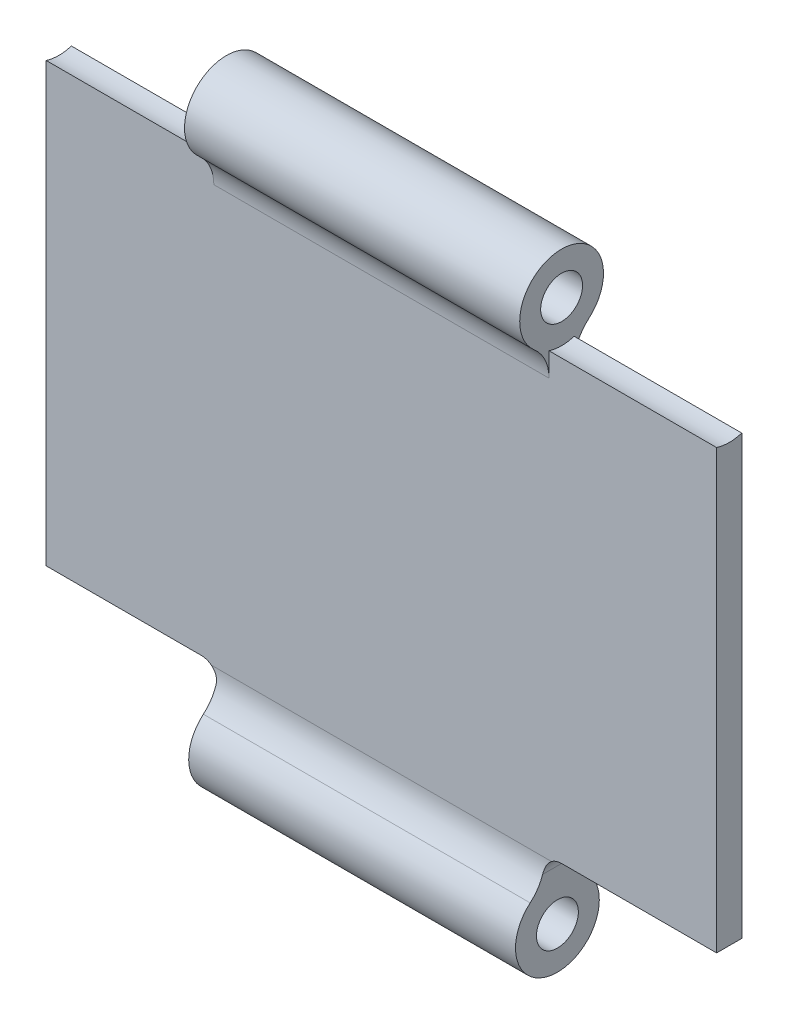
ISO-10303-21;
HEADER;
FILE_DESCRIPTION(('STEP AP214'),'2;1');
FILE_NAME('part.step','',(''),(''),'','','');
FILE_SCHEMA(('AUTOMOTIVE_DESIGN { 1 0 10303 214 1 1 1 1 }'));
ENDSEC;
DATA;
#1=APPLICATION_CONTEXT('core data for automotive mechanical design processes');
#2=APPLICATION_PROTOCOL_DEFINITION('international standard','automotive_design',2000,#1);
#3=PRODUCT_CONTEXT('',#1,'mechanical');
#4=PRODUCT('Part','Part','',(#3));
#5=PRODUCT_RELATED_PRODUCT_CATEGORY('part','',(#4));
#6=PRODUCT_DEFINITION_FORMATION('','',#4);
#7=PRODUCT_DEFINITION_CONTEXT('part definition',#1,'design');
#8=PRODUCT_DEFINITION('design','',#6,#7);
#9=PRODUCT_DEFINITION_SHAPE('','',#8);
#10=(LENGTH_UNIT() NAMED_UNIT(*) SI_UNIT(.MILLI.,.METRE.));
#11=(NAMED_UNIT(*) PLANE_ANGLE_UNIT() SI_UNIT($,.RADIAN.));
#12=(NAMED_UNIT(*) SI_UNIT($,.STERADIAN.) SOLID_ANGLE_UNIT());
#13=UNCERTAINTY_MEASURE_WITH_UNIT(LENGTH_MEASURE(1.E-05),#10,'distance_accuracy_value','');
#14=(GEOMETRIC_REPRESENTATION_CONTEXT(3) GLOBAL_UNCERTAINTY_ASSIGNED_CONTEXT((#13)) GLOBAL_UNIT_ASSIGNED_CONTEXT((#10,
#11,#12)) REPRESENTATION_CONTEXT('',''));
#15=CARTESIAN_POINT('',(0.,0.,0.));
#16=DIRECTION('',(0.,0.,1.));
#17=DIRECTION('',(1.,0.,0.));
#18=AXIS2_PLACEMENT_3D('',#15,#16,#17);
#19=CARTESIAN_POINT('',(0.,0.,3.));
#20=DIRECTION('',(0.,0.,-1.));
#21=DIRECTION('',(-1.,0.,0.));
#22=AXIS2_PLACEMENT_3D('',#19,#20,#21);
#23=PLANE('',#22);
#24=DIRECTION('',(-1.,0.,0.));
#25=VECTOR('',#24,1.);
#26=CARTESIAN_POINT('',(40.,27.7303039929153,3.));
#27=LINE('',#26,#25);
#28=CARTESIAN_POINT('',(20.,27.7303039929153,3.));
#29=VERTEX_POINT('',#28);
#30=CARTESIAN_POINT('',(40.,27.7303039929153,3.));
#31=VERTEX_POINT('',#30);
#32=EDGE_CURVE('E404',#29,#31,#27,.F.);
#33=ORIENTED_EDGE('',*,*,#32,.F.);
#34=DIRECTION('',(0.,-1.,0.));
#35=VECTOR('',#34,1.);
#36=CARTESIAN_POINT('',(20.,0.,3.));
#37=LINE('',#36,#35);
#38=CARTESIAN_POINT('',(20.,24.9006579232147,3.));
#39=VERTEX_POINT('',#38);
#40=EDGE_CURVE('E238',#29,#39,#37,.T.);
#41=ORIENTED_EDGE('',*,*,#40,.T.);
#42=DIRECTION('',(1.,0.,0.));
#43=VECTOR('',#42,1.);
#44=CARTESIAN_POINT('',(-20.,24.9006579232147,3.));
#45=LINE('',#44,#43);
#46=CARTESIAN_POINT('',(-20.,24.9006579232147,3.));
#47=VERTEX_POINT('',#46);
#48=EDGE_CURVE('E236',#39,#47,#45,.F.);
#49=ORIENTED_EDGE('',*,*,#48,.T.);
#50=DIRECTION('',(0.,1.,0.));
#51=VECTOR('',#50,1.);
#52=CARTESIAN_POINT('',(-20.,32.5,3.));
#53=LINE('',#52,#51);
#54=CARTESIAN_POINT('',(-20.,27.7303039929153,3.));
#55=VERTEX_POINT('',#54);
#56=EDGE_CURVE('E189',#47,#55,#53,.T.);
#57=ORIENTED_EDGE('',*,*,#56,.T.);
#58=DIRECTION('',(1.,0.,0.));
#59=VECTOR('',#58,1.);
#60=CARTESIAN_POINT('',(-40.,27.7303039929153,3.));
#61=LINE('',#60,#59);
#62=CARTESIAN_POINT('',(-40.,27.7303039929153,3.));
#63=VERTEX_POINT('',#62);
#64=EDGE_CURVE('E173',#55,#63,#61,.F.);
#65=ORIENTED_EDGE('',*,*,#64,.T.);
#66=DIRECTION('',(0.,1.,0.));
#67=VECTOR('',#66,1.);
#68=CARTESIAN_POINT('',(-40.,-32.5,3.));
#69=LINE('',#68,#67);
#70=CARTESIAN_POINT('',(-40.,-24.5,3.));
#71=VERTEX_POINT('',#70);
#72=EDGE_CURVE('E187',#71,#63,#69,.T.);
#73=ORIENTED_EDGE('',*,*,#72,.F.);
#74=DIRECTION('',(1.,0.,0.));
#75=VECTOR('',#74,1.);
#76=CARTESIAN_POINT('',(-40.,-24.5,3.));
#77=LINE('',#76,#75);
#78=CARTESIAN_POINT('',(-21.5,-24.5,3.));
#79=VERTEX_POINT('',#78);
#80=EDGE_CURVE('E364',#71,#79,#77,.T.);
#81=ORIENTED_EDGE('',*,*,#80,.T.);
#82=CARTESIAN_POINT('',(-21.5,-26.5,3.));
#83=DIRECTION('',(0.,0.,-1.));
#84=DIRECTION('',(-1.,0.,0.));
#85=AXIS2_PLACEMENT_3D('',#82,#83,#84);
#86=CIRCLE('',#85,2.);
#87=CARTESIAN_POINT('',(-20.29912326968,-24.9006579232147,3.));
#88=VERTEX_POINT('',#87);
#89=EDGE_CURVE('E53',#79,#88,#86,.T.);
#90=ORIENTED_EDGE('',*,*,#89,.T.);
#91=DIRECTION('',(1.,0.,0.));
#92=VECTOR('',#91,1.);
#93=CARTESIAN_POINT('',(19.5,-24.9006579232147,3.));
#94=LINE('',#93,#92);
#95=CARTESIAN_POINT('',(20.29912326968,-24.9006579232147,3.));
#96=VERTEX_POINT('',#95);
#97=EDGE_CURVE('E59',#88,#96,#94,.T.);
#98=ORIENTED_EDGE('',*,*,#97,.T.);
#99=CARTESIAN_POINT('',(21.5,-26.5,3.));
#100=DIRECTION('',(0.,0.,-1.));
#101=DIRECTION('',(-1.,0.,0.));
#102=AXIS2_PLACEMENT_3D('',#99,#100,#101);
#103=CIRCLE('',#102,2.);
#104=CARTESIAN_POINT('',(21.5,-24.5,3.));
#105=VERTEX_POINT('',#104);
#106=EDGE_CURVE('E352',#96,#105,#103,.T.);
#107=ORIENTED_EDGE('',*,*,#106,.T.);
#108=DIRECTION('',(1.,0.,0.));
#109=VECTOR('',#108,1.);
#110=CARTESIAN_POINT('',(40.,-24.5,3.));
#111=LINE('',#110,#109);
#112=CARTESIAN_POINT('',(40.,-24.5,3.));
#113=VERTEX_POINT('',#112);
#114=EDGE_CURVE('E377',#105,#113,#111,.T.);
#115=ORIENTED_EDGE('',*,*,#114,.T.);
#116=DIRECTION('',(0.,1.,0.));
#117=VECTOR('',#116,1.);
#118=CARTESIAN_POINT('',(40.,-32.5,3.));
#119=LINE('',#118,#117);
#120=EDGE_CURVE('E195',#113,#31,#119,.T.);
#121=ORIENTED_EDGE('',*,*,#120,.T.);
#122=EDGE_LOOP('',(#33,#41,#49,#57,#65,#73,#81,#90,#98,#107,#115,#121));
#123=FACE_BOUND('',#122,.T.);
#124=ADVANCED_FACE('F39',(#123),#23,.F.);
#125=CARTESIAN_POINT('',(0.,0.,0.));
#126=DIRECTION('',(0.,0.,-1.));
#127=DIRECTION('',(-1.,0.,0.));
#128=AXIS2_PLACEMENT_3D('',#125,#126,#127);
#129=PLANE('',#128);
#130=DIRECTION('',(-1.,0.,0.));
#131=VECTOR('',#130,1.);
#132=CARTESIAN_POINT('',(0.,24.9006579232147,0.));
#133=LINE('',#132,#131);
#134=CARTESIAN_POINT('',(-20.,24.9006579232147,0.));
#135=VERTEX_POINT('',#134);
#136=CARTESIAN_POINT('',(20.,24.9006579232147,0.));
#137=VERTEX_POINT('',#136);
#138=EDGE_CURVE('E244',#135,#137,#133,.F.);
#139=ORIENTED_EDGE('',*,*,#138,.T.);
#140=DIRECTION('',(0.,1.,0.));
#141=VECTOR('',#140,1.);
#142=CARTESIAN_POINT('',(20.,32.5,0.));
#143=LINE('',#142,#141);
#144=CARTESIAN_POINT('',(20.,27.7303039929153,0.));
#145=VERTEX_POINT('',#144);
#146=EDGE_CURVE('E247',#137,#145,#143,.T.);
#147=ORIENTED_EDGE('',*,*,#146,.T.);
#148=DIRECTION('',(-1.,0.,0.));
#149=VECTOR('',#148,1.);
#150=CARTESIAN_POINT('',(40.,27.7303039929153,0.));
#151=LINE('',#150,#149);
#152=CARTESIAN_POINT('',(40.,27.7303039929153,0.));
#153=VERTEX_POINT('',#152);
#154=EDGE_CURVE('E399',#145,#153,#151,.F.);
#155=ORIENTED_EDGE('',*,*,#154,.T.);
#156=DIRECTION('',(0.,1.,0.));
#157=VECTOR('',#156,1.);
#158=CARTESIAN_POINT('',(40.,-32.5,0.));
#159=LINE('',#158,#157);
#160=CARTESIAN_POINT('',(40.,-24.5,0.));
#161=VERTEX_POINT('',#160);
#162=EDGE_CURVE('E196',#161,#153,#159,.T.);
#163=ORIENTED_EDGE('',*,*,#162,.F.);
#164=DIRECTION('',(1.,0.,0.));
#165=VECTOR('',#164,1.);
#166=CARTESIAN_POINT('',(40.,-24.5,0.));
#167=LINE('',#166,#165);
#168=CARTESIAN_POINT('',(21.5,-24.5,0.));
#169=VERTEX_POINT('',#168);
#170=EDGE_CURVE('E382',#169,#161,#167,.T.);
#171=ORIENTED_EDGE('',*,*,#170,.F.);
#172=CARTESIAN_POINT('',(21.5,-26.5,0.));
#173=DIRECTION('',(0.,0.,-1.));
#174=DIRECTION('',(-1.,0.,0.));
#175=AXIS2_PLACEMENT_3D('',#172,#173,#174);
#176=CIRCLE('',#175,2.);
#177=CARTESIAN_POINT('',(20.29912326968,-24.9006579232147,0.));
#178=VERTEX_POINT('',#177);
#179=EDGE_CURVE('E271',#169,#178,#176,.F.);
#180=ORIENTED_EDGE('',*,*,#179,.T.);
#181=DIRECTION('',(-1.,0.,0.));
#182=VECTOR('',#181,1.);
#183=CARTESIAN_POINT('',(0.,-24.9006579232147,0.));
#184=LINE('',#183,#182);
#185=CARTESIAN_POINT('',(-20.29912326968,-24.9006579232147,0.));
#186=VERTEX_POINT('',#185);
#187=EDGE_CURVE('E67',#178,#186,#184,.T.);
#188=ORIENTED_EDGE('',*,*,#187,.T.);
#189=CARTESIAN_POINT('',(-21.5,-26.5,0.));
#190=DIRECTION('',(0.,0.,-1.));
#191=DIRECTION('',(-1.,0.,0.));
#192=AXIS2_PLACEMENT_3D('',#189,#190,#191);
#193=CIRCLE('',#192,2.);
#194=CARTESIAN_POINT('',(-21.5,-24.5,0.));
#195=VERTEX_POINT('',#194);
#196=EDGE_CURVE('E355',#186,#195,#193,.F.);
#197=ORIENTED_EDGE('',*,*,#196,.T.);
#198=DIRECTION('',(1.,0.,0.));
#199=VECTOR('',#198,1.);
#200=CARTESIAN_POINT('',(-40.,-24.5,0.));
#201=LINE('',#200,#199);
#202=CARTESIAN_POINT('',(-40.,-24.5,0.));
#203=VERTEX_POINT('',#202);
#204=EDGE_CURVE('E384',#203,#195,#201,.T.);
#205=ORIENTED_EDGE('',*,*,#204,.F.);
#206=DIRECTION('',(0.,1.,0.));
#207=VECTOR('',#206,1.);
#208=CARTESIAN_POINT('',(-40.,-32.5,0.));
#209=LINE('',#208,#207);
#210=CARTESIAN_POINT('',(-40.,27.7303039929153,0.));
#211=VERTEX_POINT('',#210);
#212=EDGE_CURVE('E202',#203,#211,#209,.T.);
#213=ORIENTED_EDGE('',*,*,#212,.T.);
#214=DIRECTION('',(1.,0.,0.));
#215=VECTOR('',#214,1.);
#216=CARTESIAN_POINT('',(-40.,27.7303039929153,0.));
#217=LINE('',#216,#215);
#218=CARTESIAN_POINT('',(-20.,27.7303039929153,0.));
#219=VERTEX_POINT('',#218);
#220=EDGE_CURVE('E176',#219,#211,#217,.F.);
#221=ORIENTED_EDGE('',*,*,#220,.F.);
#222=DIRECTION('',(0.,-1.,0.));
#223=VECTOR('',#222,1.);
#224=CARTESIAN_POINT('',(-20.,0.,0.));
#225=LINE('',#224,#223);
#226=EDGE_CURVE('E241',#219,#135,#225,.T.);
#227=ORIENTED_EDGE('',*,*,#226,.T.);
#228=EDGE_LOOP('',(#139,#147,#155,#163,#171,#180,#188,#197,#205,#213,#221,#227));
#229=FACE_BOUND('',#228,.T.);
#230=ADVANCED_FACE('F310',(#229),#129,.T.);
#231=CARTESIAN_POINT('',(-40.,-32.5,3.));
#232=DIRECTION('',(-1.,0.,0.));
#233=DIRECTION('',(0.,0.,1.));
#234=AXIS2_PLACEMENT_3D('',#231,#232,#233);
#235=PLANE('',#234);
#236=CARTESIAN_POINT('',(-40.,32.5,1.5));
#237=DIRECTION('',(1.,0.,0.));
#238=DIRECTION('',(0.,0.,-1.));
#239=AXIS2_PLACEMENT_3D('',#236,#237,#238);
#240=CIRCLE('',#239,5.);
#241=EDGE_CURVE('E169',#63,#211,#240,.T.);
#242=ORIENTED_EDGE('',*,*,#241,.T.);
#243=ORIENTED_EDGE('',*,*,#212,.F.);
#244=DIRECTION('',(0.,0.,-1.));
#245=VECTOR('',#244,1.);
#246=CARTESIAN_POINT('',(-40.,-24.5,135.651609764968));
#247=LINE('',#246,#245);
#248=EDGE_CURVE('E194',#71,#203,#247,.T.);
#249=ORIENTED_EDGE('',*,*,#248,.F.);
#250=ORIENTED_EDGE('',*,*,#72,.T.);
#251=EDGE_LOOP('',(#242,#243,#249,#250));
#252=FACE_BOUND('',#251,.T.);
#253=ADVANCED_FACE('F193',(#252),#235,.T.);
#254=CARTESIAN_POINT('',(40.,-32.5,3.));
#255=DIRECTION('',(-1.,0.,0.));
#256=DIRECTION('',(0.,0.,1.));
#257=AXIS2_PLACEMENT_3D('',#254,#255,#256);
#258=PLANE('',#257);
#259=CARTESIAN_POINT('',(40.,32.5,1.5));
#260=DIRECTION('',(1.,0.,0.));
#261=DIRECTION('',(0.,0.,-1.));
#262=AXIS2_PLACEMENT_3D('',#259,#260,#261);
#263=CIRCLE('',#262,5.);
#264=EDGE_CURVE('E405',#31,#153,#263,.T.);
#265=ORIENTED_EDGE('',*,*,#264,.F.);
#266=ORIENTED_EDGE('',*,*,#120,.F.);
#267=DIRECTION('',(0.,0.,-1.));
#268=VECTOR('',#267,1.);
#269=CARTESIAN_POINT('',(40.,-24.5,135.651609764968));
#270=LINE('',#269,#268);
#271=EDGE_CURVE('E205',#113,#161,#270,.T.);
#272=ORIENTED_EDGE('',*,*,#271,.T.);
#273=ORIENTED_EDGE('',*,*,#162,.T.);
#274=EDGE_LOOP('',(#265,#266,#272,#273));
#275=FACE_BOUND('',#274,.T.);
#276=ADVANCED_FACE('F321',(#275),#258,.F.);
#277=CARTESIAN_POINT('',(-40.,-24.5,135.651609764968));
#278=DIRECTION('',(0.,-1.,0.));
#279=DIRECTION('',(0.,0.,-1.));
#280=AXIS2_PLACEMENT_3D('',#277,#278,#279);
#281=PLANE('',#280);
#282=ORIENTED_EDGE('',*,*,#204,.T.);
#283=DIRECTION('',(0.,0.,-1.));
#284=VECTOR('',#283,1.);
#285=CARTESIAN_POINT('',(-21.5,-24.5,3.));
#286=LINE('',#285,#284);
#287=EDGE_CURVE('E269',#195,#79,#286,.F.);
#288=ORIENTED_EDGE('',*,*,#287,.T.);
#289=ORIENTED_EDGE('',*,*,#80,.F.);
#290=ORIENTED_EDGE('',*,*,#248,.T.);
#291=EDGE_LOOP('',(#282,#288,#289,#290));
#292=FACE_BOUND('',#291,.T.);
#293=ADVANCED_FACE('F324',(#292),#281,.T.);
#294=CARTESIAN_POINT('',(-19.5,-24.5,135.651609764968));
#295=DIRECTION('',(-1.,0.,0.));
#296=DIRECTION('',(0.,0.,1.));
#297=AXIS2_PLACEMENT_3D('',#294,#295,#296);
#298=PLANE('',#297);
#299=CARTESIAN_POINT('',(-19.5,-32.5,1.5));
#300=DIRECTION('',(-1.,0.,0.));
#301=DIRECTION('',(0.,-1.,0.));
#302=AXIS2_PLACEMENT_3D('',#299,#300,#301);
#303=CIRCLE('',#302,2.5);
#304=CARTESIAN_POINT('',(-19.5,-35.,1.5));
#305=VERTEX_POINT('',#304);
#306=EDGE_CURVE('E213',#305,#305,#303,.T.);
#307=ORIENTED_EDGE('',*,*,#306,.F.);
#308=EDGE_LOOP('',(#307));
#309=FACE_BOUND('',#308,.T.);
#310=CARTESIAN_POINT('',(-19.5,-24.9006579232147,8.));
#311=DIRECTION('',(-1.,0.,0.));
#312=DIRECTION('',(0.,0.,1.));
#313=AXIS2_PLACEMENT_3D('',#310,#311,#312);
#314=CIRCLE('',#313,5.);
#315=CARTESIAN_POINT('',(-19.5,-28.7003289616073,4.75));
#316=VERTEX_POINT('',#315);
#317=CARTESIAN_POINT('',(-19.5,-26.5,3.26269011764863));
#318=VERTEX_POINT('',#317);
#319=EDGE_CURVE('E220',#316,#318,#314,.F.);
#320=ORIENTED_EDGE('',*,*,#319,.T.);
#321=DIRECTION('',(0.,0.,-1.));
#322=VECTOR('',#321,1.);
#323=CARTESIAN_POINT('',(-19.5,-26.5,0.));
#324=LINE('',#323,#322);
#325=CARTESIAN_POINT('',(-19.5,-26.5,-0.262690117648631));
#326=VERTEX_POINT('',#325);
#327=EDGE_CURVE('E266',#318,#326,#324,.T.);
#328=ORIENTED_EDGE('',*,*,#327,.T.);
#329=CARTESIAN_POINT('',(-19.5,-24.9006579232147,-5.));
#330=DIRECTION('',(-1.,0.,0.));
#331=DIRECTION('',(0.,0.,1.));
#332=AXIS2_PLACEMENT_3D('',#329,#330,#331);
#333=CIRCLE('',#332,5.);
#334=CARTESIAN_POINT('',(-19.5,-28.7003289616073,-1.75));
#335=VERTEX_POINT('',#334);
#336=EDGE_CURVE('E225',#326,#335,#333,.F.);
#337=ORIENTED_EDGE('',*,*,#336,.T.);
#338=CARTESIAN_POINT('',(-19.5,-32.5,1.5));
#339=DIRECTION('',(-1.,0.,0.));
#340=DIRECTION('',(0.,0.,1.));
#341=AXIS2_PLACEMENT_3D('',#338,#339,#340);
#342=CIRCLE('',#341,5.);
#343=EDGE_CURVE('E212',#316,#335,#342,.F.);
#344=ORIENTED_EDGE('',*,*,#343,.F.);
#345=EDGE_LOOP('',(#320,#328,#337,#344));
#346=FACE_BOUND('',#345,.T.);
#347=ADVANCED_FACE('F370',(#309,#346),#298,.T.);
#348=CARTESIAN_POINT('',(40.,-24.5,135.651609764968));
#349=DIRECTION('',(0.,-1.,0.));
#350=DIRECTION('',(1.,0.,0.));
#351=AXIS2_PLACEMENT_3D('',#348,#349,#350);
#352=PLANE('',#351);
#353=ORIENTED_EDGE('',*,*,#114,.F.);
#354=DIRECTION('',(0.,0.,-1.));
#355=VECTOR('',#354,1.);
#356=CARTESIAN_POINT('',(21.5,-24.5,0.));
#357=LINE('',#356,#355);
#358=EDGE_CURVE('E257',#105,#169,#357,.T.);
#359=ORIENTED_EDGE('',*,*,#358,.T.);
#360=ORIENTED_EDGE('',*,*,#170,.T.);
#361=ORIENTED_EDGE('',*,*,#271,.F.);
#362=EDGE_LOOP('',(#353,#359,#360,#361));
#363=FACE_BOUND('',#362,.T.);
#364=ADVANCED_FACE('F318',(#363),#352,.T.);
#365=CARTESIAN_POINT('',(19.5,-24.5,135.651609764968));
#366=DIRECTION('',(1.,0.,0.));
#367=DIRECTION('',(0.,0.,-1.));
#368=AXIS2_PLACEMENT_3D('',#365,#366,#367);
#369=PLANE('',#368);
#370=CARTESIAN_POINT('',(19.5,-32.5,1.5));
#371=DIRECTION('',(1.,0.,0.));
#372=DIRECTION('',(0.,0.,-1.));
#373=AXIS2_PLACEMENT_3D('',#370,#371,#372);
#374=CIRCLE('',#373,2.5);
#375=CARTESIAN_POINT('',(19.5,-35.,1.5));
#376=VERTEX_POINT('',#375);
#377=EDGE_CURVE('E209',#376,#376,#374,.T.);
#378=ORIENTED_EDGE('',*,*,#377,.F.);
#379=EDGE_LOOP('',(#378));
#380=FACE_BOUND('',#379,.T.);
#381=CARTESIAN_POINT('',(19.5,-24.9006579232147,-5.));
#382=DIRECTION('',(1.,0.,0.));
#383=DIRECTION('',(0.,0.,-1.));
#384=AXIS2_PLACEMENT_3D('',#381,#382,#383);
#385=CIRCLE('',#384,5.);
#386=CARTESIAN_POINT('',(19.5,-28.7003289616073,-1.75));
#387=VERTEX_POINT('',#386);
#388=CARTESIAN_POINT('',(19.5,-26.5,-0.262690117648628));
#389=VERTEX_POINT('',#388);
#390=EDGE_CURVE('E227',#387,#389,#385,.F.);
#391=ORIENTED_EDGE('',*,*,#390,.T.);
#392=DIRECTION('',(0.,0.,-1.));
#393=VECTOR('',#392,1.);
#394=CARTESIAN_POINT('',(19.5,-26.5,3.));
#395=LINE('',#394,#393);
#396=CARTESIAN_POINT('',(19.5,-26.5,3.26269011764863));
#397=VERTEX_POINT('',#396);
#398=EDGE_CURVE('E264',#389,#397,#395,.F.);
#399=ORIENTED_EDGE('',*,*,#398,.T.);
#400=CARTESIAN_POINT('',(19.5,-24.9006579232147,8.));
#401=DIRECTION('',(1.,0.,0.));
#402=DIRECTION('',(0.,0.,-1.));
#403=AXIS2_PLACEMENT_3D('',#400,#401,#402);
#404=CIRCLE('',#403,5.);
#405=CARTESIAN_POINT('',(19.5,-28.7003289616073,4.75));
#406=VERTEX_POINT('',#405);
#407=EDGE_CURVE('E223',#397,#406,#404,.F.);
#408=ORIENTED_EDGE('',*,*,#407,.T.);
#409=CARTESIAN_POINT('',(19.5,-32.5,1.5));
#410=DIRECTION('',(1.,0.,0.));
#411=DIRECTION('',(0.,0.,-1.));
#412=AXIS2_PLACEMENT_3D('',#409,#410,#411);
#413=CIRCLE('',#412,5.);
#414=EDGE_CURVE('E375',#406,#387,#413,.T.);
#415=ORIENTED_EDGE('',*,*,#414,.T.);
#416=EDGE_LOOP('',(#391,#399,#408,#415));
#417=FACE_BOUND('',#416,.T.);
#418=ADVANCED_FACE('F447',(#380,#417),#369,.T.);
#419=CARTESIAN_POINT('',(33.642135623731,-32.5,1.5));
#420=DIRECTION('',(-1.,0.,0.));
#421=DIRECTION('',(0.,0.,1.));
#422=AXIS2_PLACEMENT_3D('',#419,#420,#421);
#423=CYLINDRICAL_SURFACE('',#422,5.);
#424=ORIENTED_EDGE('',*,*,#414,.F.);
#425=DIRECTION('',(-1.,0.,0.));
#426=VECTOR('',#425,1.);
#427=CARTESIAN_POINT('',(33.642135623731,-28.7003289616073,4.75));
#428=LINE('',#427,#426);
#429=EDGE_CURVE('E215',#406,#316,#428,.T.);
#430=ORIENTED_EDGE('',*,*,#429,.T.);
#431=ORIENTED_EDGE('',*,*,#343,.T.);
#432=DIRECTION('',(-1.,0.,0.));
#433=VECTOR('',#432,1.);
#434=CARTESIAN_POINT('',(33.642135623731,-28.7003289616073,-1.75));
#435=LINE('',#434,#433);
#436=EDGE_CURVE('E199',#335,#387,#435,.F.);
#437=ORIENTED_EDGE('',*,*,#436,.T.);
#438=EDGE_LOOP('',(#424,#430,#431,#437));
#439=FACE_BOUND('',#438,.T.);
#440=ADVANCED_FACE('F339',(#439),#423,.T.);
#441=CARTESIAN_POINT('',(40.,-32.5,1.5));
#442=DIRECTION('',(-1.,0.,0.));
#443=DIRECTION('',(0.,-1.,0.));
#444=AXIS2_PLACEMENT_3D('',#441,#442,#443);
#445=CYLINDRICAL_SURFACE('',#444,2.5);
#446=CARTESIAN_POINT('',(19.5,-35.,1.5));
#447=CARTESIAN_POINT('',(19.09375,-35.,1.5));
#448=CARTESIAN_POINT('',(18.6875,-35.,1.5));
#449=CARTESIAN_POINT('',(17.875,-35.,1.5));
#450=CARTESIAN_POINT('',(17.46875,-35.,1.5));
#451=CARTESIAN_POINT('',(16.65625,-35.,1.5));
#452=CARTESIAN_POINT('',(16.25,-35.,1.5));
#453=CARTESIAN_POINT('',(15.4375,-35.,1.5));
#454=CARTESIAN_POINT('',(15.03125,-35.,1.5));
#455=CARTESIAN_POINT('',(14.21875,-35.,1.5));
#456=CARTESIAN_POINT('',(13.8125,-35.,1.5));
#457=CARTESIAN_POINT('',(13.,-35.,1.5));
#458=CARTESIAN_POINT('',(12.59375,-35.,1.5));
#459=CARTESIAN_POINT('',(11.78125,-35.,1.5));
#460=CARTESIAN_POINT('',(11.375,-35.,1.5));
#461=CARTESIAN_POINT('',(10.5625,-35.,1.5));
#462=CARTESIAN_POINT('',(10.15625,-35.,1.5));
#463=CARTESIAN_POINT('',(9.34375000000001,-35.,1.5));
#464=CARTESIAN_POINT('',(8.93750000000001,-35.,1.5));
#465=CARTESIAN_POINT('',(8.12500000000001,-35.,1.5));
#466=CARTESIAN_POINT('',(7.71875000000001,-35.,1.5));
#467=CARTESIAN_POINT('',(6.90625000000001,-35.,1.5));
#468=CARTESIAN_POINT('',(6.50000000000001,-35.,1.5));
#469=CARTESIAN_POINT('',(5.68750000000001,-35.,1.5));
#470=CARTESIAN_POINT('',(5.28125000000001,-35.,1.5));
#471=CARTESIAN_POINT('',(4.46875000000001,-35.,1.5));
#472=CARTESIAN_POINT('',(4.06250000000001,-35.,1.5));
#473=CARTESIAN_POINT('',(3.25000000000001,-35.,1.5));
#474=CARTESIAN_POINT('',(2.84375000000001,-35.,1.5));
#475=CARTESIAN_POINT('',(2.03125000000001,-35.,1.5));
#476=CARTESIAN_POINT('',(1.62500000000001,-35.,1.5));
#477=CARTESIAN_POINT('',(0.81250000000001,-35.,1.5));
#478=CARTESIAN_POINT('',(0.406250000000009,-35.,1.5));
#479=CARTESIAN_POINT('',(-0.406249999999992,-35.,1.5));
#480=CARTESIAN_POINT('',(-0.812499999999991,-35.,1.5));
#481=CARTESIAN_POINT('',(-1.62499999999999,-35.,1.5));
#482=CARTESIAN_POINT('',(-2.03124999999999,-35.,1.5));
#483=CARTESIAN_POINT('',(-2.84374999999999,-35.,1.5));
#484=CARTESIAN_POINT('',(-3.24999999999999,-35.,1.5));
#485=CARTESIAN_POINT('',(-4.06249999999999,-35.,1.5));
#486=CARTESIAN_POINT('',(-4.46874999999999,-35.,1.5));
#487=CARTESIAN_POINT('',(-5.28124999999998,-35.,1.5));
#488=CARTESIAN_POINT('',(-5.68749999999999,-35.,1.5));
#489=CARTESIAN_POINT('',(-6.49999999999999,-35.,1.5));
#490=CARTESIAN_POINT('',(-6.90624999999999,-35.,1.5));
#491=CARTESIAN_POINT('',(-7.71874999999998,-35.,1.5));
#492=CARTESIAN_POINT('',(-8.12499999999998,-35.,1.5));
#493=CARTESIAN_POINT('',(-8.93749999999999,-35.,1.5));
#494=CARTESIAN_POINT('',(-9.34374999999999,-35.,1.5));
#495=CARTESIAN_POINT('',(-10.15625,-35.,1.5));
#496=CARTESIAN_POINT('',(-10.5625,-35.,1.5));
#497=CARTESIAN_POINT('',(-11.375,-35.,1.5));
#498=CARTESIAN_POINT('',(-11.78125,-35.,1.5));
#499=CARTESIAN_POINT('',(-12.59375,-35.,1.5));
#500=CARTESIAN_POINT('',(-13.,-35.,1.5));
#501=CARTESIAN_POINT('',(-13.8125,-35.,1.5));
#502=CARTESIAN_POINT('',(-14.21875,-35.,1.5));
#503=CARTESIAN_POINT('',(-15.03125,-35.,1.5));
#504=CARTESIAN_POINT('',(-15.4375,-35.,1.5));
#505=CARTESIAN_POINT('',(-16.25,-35.,1.5));
#506=CARTESIAN_POINT('',(-16.65625,-35.,1.5));
#507=CARTESIAN_POINT('',(-17.46875,-35.,1.5));
#508=CARTESIAN_POINT('',(-17.875,-35.,1.5));
#509=CARTESIAN_POINT('',(-18.6875,-35.,1.5));
#510=CARTESIAN_POINT('',(-19.09375,-35.,1.5));
#511=CARTESIAN_POINT('',(-19.5,-35.,1.5));
#512=B_SPLINE_CURVE_WITH_KNOTS('',3,(#446,#447,#448,#449,#450,#451,#452,#453,#454,#455,#456,
#457,#458,#459,#460,#461,#462,#463,#464,#465,#466,#467,#468,#469,#470,#471,#472,#473,#474,#475,
#476,#477,#478,#479,#480,#481,#482,#483,#484,#485,#486,#487,#488,#489,#490,#491,#492,#493,#494,
#495,#496,#497,#498,#499,#500,#501,#502,#503,#504,#505,#506,#507,#508,#509,#510,#511),
.UNSPECIFIED.,.F.,.F.,(4,2,2,2,2,2,2,2,2,2,2,2,2,2,2,2,2,2,2,2,2,2,2,2,2,2,2,2,2,2,2,2,4),(0.,
1.21875,2.4375,3.65625,4.875,6.09375,7.3125,8.53125,9.74999999999999,10.96875,12.1875,13.40625,
14.625,15.84375,17.0625,18.28125,19.5,20.71875,21.9375,23.15625,24.375,25.59375,26.8125,
28.03125,29.25,30.46875,31.6875,32.90625,34.125,35.34375,36.5625,37.78125,39.),.UNSPECIFIED.);
#513=EDGE_CURVE('BSEAM330',#376,#305,#512,.T.);
#514=ORIENTED_EDGE('',*,*,#377,.T.);
#515=ORIENTED_EDGE('',*,*,#306,.T.);
#516=ORIENTED_EDGE('',*,*,#513,.T.);
#517=ORIENTED_EDGE('',*,*,#513,.F.);
#518=EDGE_LOOP('',(#514,#516,#515,#517));
#519=FACE_BOUND('',#518,.T.);
#520=ADVANCED_FACE('F330',(#519),#445,.F.);
#521=CARTESIAN_POINT('',(33.642135623731,-24.9006579232147,8.));
#522=DIRECTION('',(-1.,0.,0.));
#523=DIRECTION('',(0.,0.,1.));
#524=AXIS2_PLACEMENT_3D('',#521,#522,#523);
#525=CYLINDRICAL_SURFACE('',#524,5.);
#526=ORIENTED_EDGE('',*,*,#407,.F.);
#527=CARTESIAN_POINT('',(19.5,-26.5,3.26269011764863));
#528=CARTESIAN_POINT('',(19.4999936966678,-26.4485390306566,3.24530870783693));
#529=CARTESIAN_POINT('',(19.501986360827,-26.3967839827995,3.22877786014896));
#530=CARTESIAN_POINT('',(19.5100574791647,-26.293045638152,3.19748263196914));
#531=CARTESIAN_POINT('',(19.5161369747705,-26.2410622865392,3.18271870286248));
#532=CARTESIAN_POINT('',(19.5324540650706,-26.1373532528805,3.15505809683407));
#533=CARTESIAN_POINT('',(19.5426836750113,-26.0856272680361,3.1421578983974));
#534=CARTESIAN_POINT('',(19.5673156075382,-25.9827642213211,3.11821335981919));
#535=CARTESIAN_POINT('',(19.5817174232379,-25.9316270886944,3.10716879449188));
#536=CARTESIAN_POINT('',(19.6312621603462,-25.7794581144575,3.07675161729261));
#537=CARTESIAN_POINT('',(19.6727188083601,-25.6798343516974,3.06013902114915));
#538=CARTESIAN_POINT('',(19.7715774176784,-25.4879618750905,3.03366436460592));
#539=CARTESIAN_POINT('',(19.8289772326559,-25.3957121706727,3.02380139616549));
#540=CARTESIAN_POINT('',(19.9508066860262,-25.231449118901,3.01035306357623));
#541=CARTESIAN_POINT('',(20.0136795036377,-25.1583280981234,3.00617834323463));
#542=CARTESIAN_POINT('',(20.11539275904,-25.0559824032002,3.00229587156852));
#543=CARTESIAN_POINT('',(20.1505551458474,-25.023071789938,3.00139849790321));
#544=CARTESIAN_POINT('',(20.2231670690983,-24.9598658978559,3.00025096271696));
#545=CARTESIAN_POINT('',(20.2606166025268,-24.9295706155885,3.00000080034288));
#546=CARTESIAN_POINT('',(20.29912326968,-24.9006579232147,3.));
#547=B_SPLINE_CURVE_WITH_KNOTS('',3,(#527,#528,#529,#530,#531,#532,#533,#534,#535,#536,#537,
#538,#539,#540,#541,#542,#543,#544,#545,#546),.UNSPECIFIED.,.F.,.F.,(4,2,2,2,2,2,2,2,2,4),(0.,
0.16291594834693,0.325873427513106,0.488518854839466,0.651144530455444,0.976908622207142,
1.30262887965612,1.59106417732792,1.73545996109784,1.87985555452942),.UNSPECIFIED.);
#548=EDGE_CURVE('E280',#397,#96,#547,.T.);
#549=ORIENTED_EDGE('',*,*,#548,.T.);
#550=ORIENTED_EDGE('',*,*,#97,.F.);
#551=CARTESIAN_POINT('',(-20.29912326968,-24.9006579232147,3.));
#552=CARTESIAN_POINT('',(-20.2556342851634,-24.933312149289,3.00000148283011));
#553=CARTESIAN_POINT('',(-20.2134965946665,-24.9677271872563,3.0003202937365));
#554=CARTESIAN_POINT('',(-20.1321647842561,-25.0398680129898,3.0018074908761));
#555=CARTESIAN_POINT('',(-20.0929710450177,-25.0775942275531,3.00297598677208));
#556=CARTESIAN_POINT('',(-19.9803628172862,-25.1952227585531,3.00807027847123));
#557=CARTESIAN_POINT('',(-19.9117117726822,-25.2797326535353,3.01358284916839));
#558=CARTESIAN_POINT('',(-19.7891211933571,-25.4585209012946,3.03040651748096));
#559=CARTESIAN_POINT('',(-19.735211957861,-25.5528188313157,3.04172942193871));
#560=CARTESIAN_POINT('',(-19.6436465224966,-25.7479654372522,3.07132997620063));
#561=CARTESIAN_POINT('',(-19.6059846675166,-25.8488118198098,3.0896052019845));
#562=CARTESIAN_POINT('',(-19.5509455651133,-26.0416980298741,3.13105854413074));
#563=CARTESIAN_POINT('',(-19.5317111693805,-26.1333885083769,3.15341333081105));
#564=CARTESIAN_POINT('',(-19.5126029798928,-26.2710661085761,3.19123061490391));
#565=CARTESIAN_POINT('',(-19.507857598662,-26.3170194007019,3.20456304406775));
#566=CARTESIAN_POINT('',(-19.5015558781655,-26.4087194068859,3.23260524437806));
#567=CARTESIAN_POINT('',(-19.4999991935453,-26.4544661427799,3.24731486618606));
#568=CARTESIAN_POINT('',(-19.5,-26.5,3.26269011764863));
#569=B_SPLINE_CURVE_WITH_KNOTS('',3,(#551,#552,#553,#554,#555,#556,#557,#558,#559,#560,#561,
#562,#563,#564,#565,#566,#567,#568),.UNSPECIFIED.,.F.,.F.,(4,2,2,2,2,2,2,2,4),(0.,
0.163057037340509,0.326135123025453,0.651514296087931,0.977557287084462,1.30348670284221,
1.59129935396486,1.73543831954241,1.87956167320295),.UNSPECIFIED.);
#570=EDGE_CURVE('E11',#88,#318,#569,.T.);
#571=ORIENTED_EDGE('',*,*,#570,.T.);
#572=ORIENTED_EDGE('',*,*,#319,.F.);
#573=ORIENTED_EDGE('',*,*,#429,.F.);
#574=EDGE_LOOP('',(#526,#549,#550,#571,#572,#573));
#575=FACE_BOUND('',#574,.T.);
#576=ADVANCED_FACE('F327',(#575),#525,.F.);
#577=CARTESIAN_POINT('',(33.642135623731,-24.9006579232147,-5.));
#578=DIRECTION('',(-1.,0.,0.));
#579=DIRECTION('',(0.,0.,1.));
#580=AXIS2_PLACEMENT_3D('',#577,#578,#579);
#581=CYLINDRICAL_SURFACE('',#580,5.);
#582=ORIENTED_EDGE('',*,*,#390,.F.);
#583=ORIENTED_EDGE('',*,*,#436,.F.);
#584=ORIENTED_EDGE('',*,*,#336,.F.);
#585=CARTESIAN_POINT('',(-19.5,-26.5,-0.262690117648631));
#586=CARTESIAN_POINT('',(-19.4999936966678,-26.4485390306566,-0.245308707836929));
#587=CARTESIAN_POINT('',(-19.501986360827,-26.3967839827995,-0.228777860148957));
#588=CARTESIAN_POINT('',(-19.5100574791647,-26.293045638152,-0.197482631969144));
#589=CARTESIAN_POINT('',(-19.5161369747705,-26.2410622865393,-0.182718702862479));
#590=CARTESIAN_POINT('',(-19.5324540650706,-26.1373532528805,-0.155058096834066));
#591=CARTESIAN_POINT('',(-19.5426836750113,-26.0856272680361,-0.142157898397405));
#592=CARTESIAN_POINT('',(-19.5673156075382,-25.9827642213211,-0.118213359819189));
#593=CARTESIAN_POINT('',(-19.5817174232379,-25.9316270886944,-0.107168794491885));
#594=CARTESIAN_POINT('',(-19.6312621603462,-25.7794581144575,-0.0767516172926081));
#595=CARTESIAN_POINT('',(-19.6727188083601,-25.6798343516974,-0.0601390211491482));
#596=CARTESIAN_POINT('',(-19.7715774176784,-25.4879618750905,-0.0336643646059183));
#597=CARTESIAN_POINT('',(-19.8289772326559,-25.3957121706727,-0.0238013961654859));
#598=CARTESIAN_POINT('',(-19.9508066860262,-25.231449118901,-0.0103530635762288));
#599=CARTESIAN_POINT('',(-20.0136795036377,-25.1583280981234,-0.00617834323463423));
#600=CARTESIAN_POINT('',(-20.11539275904,-25.0559824032002,-0.00229587156851568));
#601=CARTESIAN_POINT('',(-20.1505551458474,-25.023071789938,-0.00139849790320961));
#602=CARTESIAN_POINT('',(-20.2231670690983,-24.9598658978559,-0.000250962716957362));
#603=CARTESIAN_POINT('',(-20.2606166025268,-24.9295706155885,-8.00342876513174E-07));
#604=CARTESIAN_POINT('',(-20.29912326968,-24.9006579232147,0.));
#605=B_SPLINE_CURVE_WITH_KNOTS('',3,(#585,#586,#587,#588,#589,#590,#591,#592,#593,#594,#595,
#596,#597,#598,#599,#600,#601,#602,#603,#604),.UNSPECIFIED.,.F.,.F.,(4,2,2,2,2,2,2,2,2,4),(0.,
0.162915948346927,0.325873427513106,0.488518854839463,0.65114453045544,0.976908622207134,
1.30262887965611,1.59106417732792,1.73545996109784,1.87985555452943),.UNSPECIFIED.);
#606=EDGE_CURVE('E353',#326,#186,#605,.T.);
#607=ORIENTED_EDGE('',*,*,#606,.T.);
#608=ORIENTED_EDGE('',*,*,#187,.F.);
#609=CARTESIAN_POINT('',(20.29912326968,-24.9006579232147,0.));
#610=CARTESIAN_POINT('',(20.2556342851634,-24.933312149289,-1.48283011471906E-06));
#611=CARTESIAN_POINT('',(20.2134965946665,-24.9677271872563,-0.000320293736501921));
#612=CARTESIAN_POINT('',(20.132164784256,-25.0398680129898,-0.00180749087609766));
#613=CARTESIAN_POINT('',(20.0929710450177,-25.0775942275531,-0.00297598677208535));
#614=CARTESIAN_POINT('',(19.9803628172862,-25.1952227585531,-0.0080702784712348));
#615=CARTESIAN_POINT('',(19.9117117726822,-25.2797326535354,-0.0135828491683937));
#616=CARTESIAN_POINT('',(19.7891211933571,-25.4585209012947,-0.0304065174809556));
#617=CARTESIAN_POINT('',(19.735211957861,-25.5528188313157,-0.0417294219387063));
#618=CARTESIAN_POINT('',(19.6436465224966,-25.7479654372522,-0.0713299762006369));
#619=CARTESIAN_POINT('',(19.6059846675166,-25.8488118198098,-0.0896052019844984));
#620=CARTESIAN_POINT('',(19.5509455651133,-26.0416980298742,-0.131058544130742));
#621=CARTESIAN_POINT('',(19.5317111693805,-26.1333885083769,-0.153413330811054));
#622=CARTESIAN_POINT('',(19.5126029798928,-26.2710661085761,-0.191230614903914));
#623=CARTESIAN_POINT('',(19.507857598662,-26.3170194007019,-0.204563044067745));
#624=CARTESIAN_POINT('',(19.5015558781655,-26.4087194068859,-0.232605244378053));
#625=CARTESIAN_POINT('',(19.4999991935453,-26.4544661427799,-0.247314866186056));
#626=CARTESIAN_POINT('',(19.5,-26.5,-0.262690117648628));
#627=B_SPLINE_CURVE_WITH_KNOTS('',3,(#609,#610,#611,#612,#613,#614,#615,#616,#617,#618,#619,
#620,#621,#622,#623,#624,#625,#626),.UNSPECIFIED.,.F.,.F.,(4,2,2,2,2,2,2,2,4),(0.,
0.163057037340514,0.326135123025456,0.651514296087931,0.977557287084466,1.30348670284221,
1.59129935396485,1.73543831954239,1.87956167320293),.UNSPECIFIED.);
#628=EDGE_CURVE('E273',#178,#389,#627,.T.);
#629=ORIENTED_EDGE('',*,*,#628,.T.);
#630=EDGE_LOOP('',(#582,#583,#584,#607,#608,#629));
#631=FACE_BOUND('',#630,.T.);
#632=ADVANCED_FACE('F286',(#631),#581,.F.);
#633=CARTESIAN_POINT('',(20.,32.5,1.5));
#634=DIRECTION('',(-1.,0.,0.));
#635=DIRECTION('',(0.,0.,1.));
#636=AXIS2_PLACEMENT_3D('',#633,#634,#635);
#637=CYLINDRICAL_SURFACE('',#636,5.);
#638=CARTESIAN_POINT('',(-20.,32.5,1.5));
#639=DIRECTION('',(1.,0.,0.));
#640=DIRECTION('',(0.,0.,-1.));
#641=AXIS2_PLACEMENT_3D('',#638,#639,#640);
#642=CIRCLE('',#641,5.);
#643=CARTESIAN_POINT('',(-20.,28.7003289616073,-1.75));
#644=VERTEX_POINT('',#643);
#645=CARTESIAN_POINT('',(-20.,28.7003289616073,4.75));
#646=VERTEX_POINT('',#645);
#647=EDGE_CURVE('E407',#644,#646,#642,.T.);
#648=ORIENTED_EDGE('',*,*,#647,.T.);
#649=DIRECTION('',(-1.,0.,0.));
#650=VECTOR('',#649,1.);
#651=CARTESIAN_POINT('',(20.,28.7003289616073,4.75));
#652=LINE('',#651,#650);
#653=CARTESIAN_POINT('',(20.,28.7003289616073,4.75));
#654=VERTEX_POINT('',#653);
#655=EDGE_CURVE('E232',#646,#654,#652,.F.);
#656=ORIENTED_EDGE('',*,*,#655,.T.);
#657=CARTESIAN_POINT('',(20.,32.5,1.5));
#658=DIRECTION('',(1.,0.,0.));
#659=DIRECTION('',(0.,0.,-1.));
#660=AXIS2_PLACEMENT_3D('',#657,#658,#659);
#661=CIRCLE('',#660,5.);
#662=CARTESIAN_POINT('',(20.,28.7003289616073,-1.75));
#663=VERTEX_POINT('',#662);
#664=EDGE_CURVE('E412',#663,#654,#661,.T.);
#665=ORIENTED_EDGE('',*,*,#664,.F.);
#666=DIRECTION('',(-1.,0.,0.));
#667=VECTOR('',#666,1.);
#668=CARTESIAN_POINT('',(20.,28.7003289616073,-1.75));
#669=LINE('',#668,#667);
#670=EDGE_CURVE('E230',#663,#644,#669,.T.);
#671=ORIENTED_EDGE('',*,*,#670,.T.);
#672=EDGE_LOOP('',(#648,#656,#665,#671));
#673=FACE_BOUND('',#672,.T.);
#674=ADVANCED_FACE('F336',(#673),#637,.T.);
#675=CARTESIAN_POINT('',(20.,32.5,1.5));
#676=DIRECTION('',(1.,0.,0.));
#677=DIRECTION('',(0.,0.,-1.));
#678=AXIS2_PLACEMENT_3D('',#675,#676,#677);
#679=PLANE('',#678);
#680=CARTESIAN_POINT('',(20.,32.5,1.5));
#681=DIRECTION('',(1.,0.,0.));
#682=DIRECTION('',(0.,0.,-1.));
#683=AXIS2_PLACEMENT_3D('',#680,#681,#682);
#684=CIRCLE('',#683,2.5);
#685=CARTESIAN_POINT('',(20.,32.5,-1.));
#686=VERTEX_POINT('',#685);
#687=EDGE_CURVE('E261',#686,#686,#684,.T.);
#688=ORIENTED_EDGE('',*,*,#687,.F.);
#689=EDGE_LOOP('',(#688));
#690=FACE_BOUND('',#689,.T.);
#691=CARTESIAN_POINT('',(20.,32.5,1.5));
#692=DIRECTION('',(1.,0.,0.));
#693=DIRECTION('',(0.,0.,-1.));
#694=AXIS2_PLACEMENT_3D('',#691,#692,#693);
#695=CIRCLE('',#694,5.);
#696=EDGE_CURVE('E190',#29,#145,#695,.T.);
#697=ORIENTED_EDGE('',*,*,#696,.T.);
#698=ORIENTED_EDGE('',*,*,#146,.F.);
#699=CARTESIAN_POINT('',(20.,24.9006579232147,-5.));
#700=DIRECTION('',(1.,0.,0.));
#701=DIRECTION('',(0.,0.,-1.));
#702=AXIS2_PLACEMENT_3D('',#699,#700,#701);
#703=CIRCLE('',#702,5.);
#704=EDGE_CURVE('E253',#137,#663,#703,.F.);
#705=ORIENTED_EDGE('',*,*,#704,.T.);
#706=ORIENTED_EDGE('',*,*,#664,.T.);
#707=CARTESIAN_POINT('',(20.,24.9006579232147,8.));
#708=DIRECTION('',(1.,0.,0.));
#709=DIRECTION('',(0.,0.,-1.));
#710=AXIS2_PLACEMENT_3D('',#707,#708,#709);
#711=CIRCLE('',#710,5.);
#712=EDGE_CURVE('E249',#654,#39,#711,.F.);
#713=ORIENTED_EDGE('',*,*,#712,.T.);
#714=ORIENTED_EDGE('',*,*,#40,.F.);
#715=EDGE_LOOP('',(#697,#698,#705,#706,#713,#714));
#716=FACE_BOUND('',#715,.T.);
#717=ADVANCED_FACE('F424',(#690,#716),#679,.T.);
#718=CARTESIAN_POINT('',(-20.,32.5,1.5));
#719=DIRECTION('',(1.,0.,0.));
#720=DIRECTION('',(0.,0.,-1.));
#721=AXIS2_PLACEMENT_3D('',#718,#719,#720);
#722=PLANE('',#721);
#723=CARTESIAN_POINT('',(-20.,32.5,1.5));
#724=DIRECTION('',(1.,0.,0.));
#725=DIRECTION('',(0.,0.,-1.));
#726=AXIS2_PLACEMENT_3D('',#723,#724,#725);
#727=CIRCLE('',#726,2.5);
#728=CARTESIAN_POINT('',(-20.,32.5,-1.));
#729=VERTEX_POINT('',#728);
#730=EDGE_CURVE('E258',#729,#729,#727,.T.);
#731=ORIENTED_EDGE('',*,*,#730,.T.);
#732=EDGE_LOOP('',(#731));
#733=FACE_BOUND('',#732,.T.);
#734=CARTESIAN_POINT('',(-20.,32.5,1.5));
#735=DIRECTION('',(1.,0.,0.));
#736=DIRECTION('',(0.,0.,-1.));
#737=AXIS2_PLACEMENT_3D('',#734,#735,#736);
#738=CIRCLE('',#737,5.);
#739=EDGE_CURVE('E181',#55,#219,#738,.T.);
#740=ORIENTED_EDGE('',*,*,#739,.F.);
#741=ORIENTED_EDGE('',*,*,#56,.F.);
#742=CARTESIAN_POINT('',(-20.,24.9006579232147,8.));
#743=DIRECTION('',(1.,0.,0.));
#744=DIRECTION('',(0.,0.,-1.));
#745=AXIS2_PLACEMENT_3D('',#742,#743,#744);
#746=CIRCLE('',#745,5.);
#747=EDGE_CURVE('E251',#47,#646,#746,.T.);
#748=ORIENTED_EDGE('',*,*,#747,.T.);
#749=ORIENTED_EDGE('',*,*,#647,.F.);
#750=CARTESIAN_POINT('',(-20.,24.9006579232147,-5.));
#751=DIRECTION('',(1.,0.,0.));
#752=DIRECTION('',(0.,0.,-1.));
#753=AXIS2_PLACEMENT_3D('',#750,#751,#752);
#754=CIRCLE('',#753,5.);
#755=EDGE_CURVE('E255',#644,#135,#754,.T.);
#756=ORIENTED_EDGE('',*,*,#755,.T.);
#757=ORIENTED_EDGE('',*,*,#226,.F.);
#758=EDGE_LOOP('',(#740,#741,#748,#749,#756,#757));
#759=FACE_BOUND('',#758,.T.);
#760=ADVANCED_FACE('F426',(#733,#759),#722,.F.);
#761=CARTESIAN_POINT('',(40.,32.5,1.5));
#762=DIRECTION('',(-1.,0.,0.));
#763=DIRECTION('',(0.,0.,1.));
#764=AXIS2_PLACEMENT_3D('',#761,#762,#763);
#765=CYLINDRICAL_SURFACE('',#764,5.);
#766=ORIENTED_EDGE('',*,*,#32,.T.);
#767=ORIENTED_EDGE('',*,*,#264,.T.);
#768=ORIENTED_EDGE('',*,*,#154,.F.);
#769=ORIENTED_EDGE('',*,*,#696,.F.);
#770=EDGE_LOOP('',(#766,#767,#768,#769));
#771=FACE_BOUND('',#770,.T.);
#772=ADVANCED_FACE('F306',(#771),#765,.F.);
#773=CARTESIAN_POINT('',(-40.,32.5,1.5));
#774=DIRECTION('',(1.,0.,0.));
#775=DIRECTION('',(0.,0.,-1.));
#776=AXIS2_PLACEMENT_3D('',#773,#774,#775);
#777=CYLINDRICAL_SURFACE('',#776,5.);
#778=ORIENTED_EDGE('',*,*,#739,.T.);
#779=ORIENTED_EDGE('',*,*,#220,.T.);
#780=ORIENTED_EDGE('',*,*,#241,.F.);
#781=ORIENTED_EDGE('',*,*,#64,.F.);
#782=EDGE_LOOP('',(#778,#779,#780,#781));
#783=FACE_BOUND('',#782,.T.);
#784=ADVANCED_FACE('F172',(#783),#777,.F.);
#785=CARTESIAN_POINT('',(20.,24.9006579232147,8.));
#786=DIRECTION('',(-1.,0.,0.));
#787=DIRECTION('',(0.,0.,1.));
#788=AXIS2_PLACEMENT_3D('',#785,#786,#787);
#789=CYLINDRICAL_SURFACE('',#788,5.);
#790=ORIENTED_EDGE('',*,*,#747,.F.);
#791=ORIENTED_EDGE('',*,*,#48,.F.);
#792=ORIENTED_EDGE('',*,*,#712,.F.);
#793=ORIENTED_EDGE('',*,*,#655,.F.);
#794=EDGE_LOOP('',(#790,#791,#792,#793));
#795=FACE_BOUND('',#794,.T.);
#796=ADVANCED_FACE('F298',(#795),#789,.F.);
#797=CARTESIAN_POINT('',(20.,24.9006579232147,-5.));
#798=DIRECTION('',(-1.,0.,0.));
#799=DIRECTION('',(0.,0.,1.));
#800=AXIS2_PLACEMENT_3D('',#797,#798,#799);
#801=CYLINDRICAL_SURFACE('',#800,5.);
#802=ORIENTED_EDGE('',*,*,#755,.F.);
#803=ORIENTED_EDGE('',*,*,#670,.F.);
#804=ORIENTED_EDGE('',*,*,#704,.F.);
#805=ORIENTED_EDGE('',*,*,#138,.F.);
#806=EDGE_LOOP('',(#802,#803,#804,#805));
#807=FACE_BOUND('',#806,.T.);
#808=ADVANCED_FACE('F295',(#807),#801,.F.);
#809=CARTESIAN_POINT('',(-40.,32.5,1.5));
#810=DIRECTION('',(1.,0.,0.));
#811=DIRECTION('',(0.,0.,-1.));
#812=AXIS2_PLACEMENT_3D('',#809,#810,#811);
#813=CYLINDRICAL_SURFACE('',#812,2.5);
#814=ORIENTED_EDGE('',*,*,#687,.T.);
#815=EDGE_LOOP('',(#814));
#816=FACE_BOUND('',#815,.T.);
#817=ORIENTED_EDGE('',*,*,#730,.F.);
#818=EDGE_LOOP('',(#817));
#819=FACE_BOUND('',#818,.T.);
#820=ADVANCED_FACE('F293',(#816,#819),#813,.F.);
#821=CARTESIAN_POINT('',(21.5,-26.5,135.651609764968));
#822=DIRECTION('',(0.,0.,1.));
#823=DIRECTION('',(1.,0.,0.));
#824=AXIS2_PLACEMENT_3D('',#821,#822,#823);
#825=CYLINDRICAL_SURFACE('',#824,2.);
#826=ORIENTED_EDGE('',*,*,#548,.F.);
#827=ORIENTED_EDGE('',*,*,#398,.F.);
#828=ORIENTED_EDGE('',*,*,#628,.F.);
#829=ORIENTED_EDGE('',*,*,#179,.F.);
#830=ORIENTED_EDGE('',*,*,#358,.F.);
#831=ORIENTED_EDGE('',*,*,#106,.F.);
#832=EDGE_LOOP('',(#826,#827,#828,#829,#830,#831));
#833=FACE_BOUND('',#832,.T.);
#834=ADVANCED_FACE('F289',(#833),#825,.F.);
#835=CARTESIAN_POINT('',(-21.5,-26.5,135.651609764968));
#836=DIRECTION('',(0.,0.,1.));
#837=DIRECTION('',(1.,0.,0.));
#838=AXIS2_PLACEMENT_3D('',#835,#836,#837);
#839=CYLINDRICAL_SURFACE('',#838,2.);
#840=ORIENTED_EDGE('',*,*,#89,.F.);
#841=ORIENTED_EDGE('',*,*,#287,.F.);
#842=ORIENTED_EDGE('',*,*,#196,.F.);
#843=ORIENTED_EDGE('',*,*,#606,.F.);
#844=ORIENTED_EDGE('',*,*,#327,.F.);
#845=ORIENTED_EDGE('',*,*,#570,.F.);
#846=EDGE_LOOP('',(#840,#841,#842,#843,#844,#845));
#847=FACE_BOUND('',#846,.T.);
#848=ADVANCED_FACE('F41',(#847),#839,.F.);
#849=CLOSED_SHELL('',(#124,#230,#253,#276,#293,#347,#364,#418,#440,#520,#576,#632,#674,#717,
#760,#772,#784,#796,#808,#820,#834,#848));
#850=MANIFOLD_SOLID_BREP('B2',#849);
#851=ADVANCED_BREP_SHAPE_REPRESENTATION('',(#18,#850),#14);
#852=SHAPE_DEFINITION_REPRESENTATION(#9,#851);
ENDSEC;
END-ISO-10303-21;
